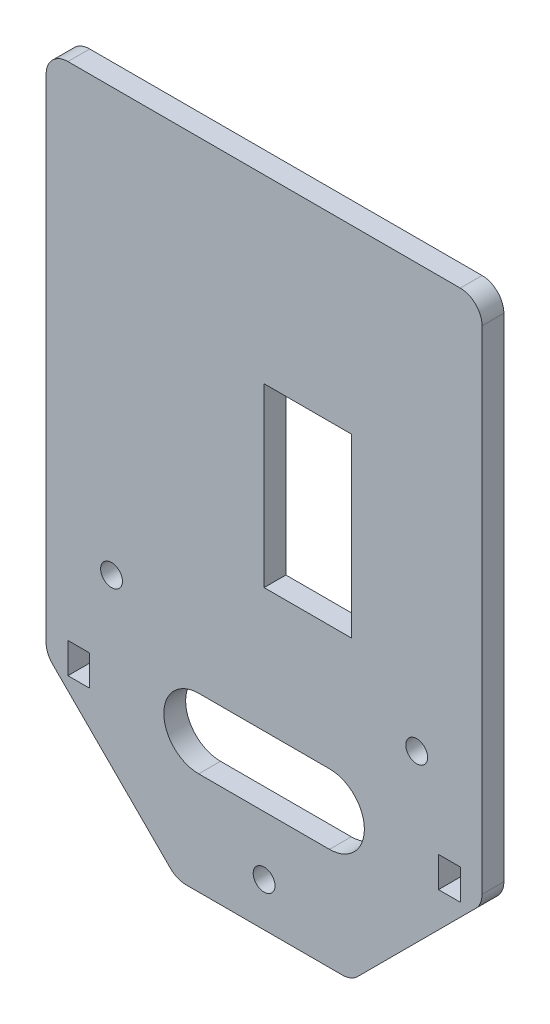
ISO-10303-21;
HEADER;
FILE_DESCRIPTION(('STEP AP214'),'2;1');
FILE_NAME('part.step','',(''),(''),'','','');
FILE_SCHEMA(('AUTOMOTIVE_DESIGN { 1 0 10303 214 1 1 1 1 }'));
ENDSEC;
DATA;
#1=APPLICATION_CONTEXT('core data for automotive mechanical design processes');
#2=APPLICATION_PROTOCOL_DEFINITION('international standard','automotive_design',2000,#1);
#3=PRODUCT_CONTEXT('',#1,'mechanical');
#4=PRODUCT('Part','Part','',(#3));
#5=PRODUCT_RELATED_PRODUCT_CATEGORY('part','',(#4));
#6=PRODUCT_DEFINITION_FORMATION('','',#4);
#7=PRODUCT_DEFINITION_CONTEXT('part definition',#1,'design');
#8=PRODUCT_DEFINITION('design','',#6,#7);
#9=PRODUCT_DEFINITION_SHAPE('','',#8);
#10=(LENGTH_UNIT() NAMED_UNIT(*) SI_UNIT(.MILLI.,.METRE.));
#11=(NAMED_UNIT(*) PLANE_ANGLE_UNIT() SI_UNIT($,.RADIAN.));
#12=(NAMED_UNIT(*) SI_UNIT($,.STERADIAN.) SOLID_ANGLE_UNIT());
#13=UNCERTAINTY_MEASURE_WITH_UNIT(LENGTH_MEASURE(1.E-05),#10,'distance_accuracy_value','');
#14=(GEOMETRIC_REPRESENTATION_CONTEXT(3) GLOBAL_UNCERTAINTY_ASSIGNED_CONTEXT((#13)) GLOBAL_UNIT_ASSIGNED_CONTEXT((#10,
#11,#12)) REPRESENTATION_CONTEXT('',''));
#15=CARTESIAN_POINT('',(0.,0.,0.));
#16=DIRECTION('',(0.,0.,1.));
#17=DIRECTION('',(1.,0.,0.));
#18=AXIS2_PLACEMENT_3D('',#15,#16,#17);
#19=CARTESIAN_POINT('',(100.,40.,5.));
#20=DIRECTION('',(-1.,0.,0.));
#21=DIRECTION('',(0.,0.,1.));
#22=AXIS2_PLACEMENT_3D('',#19,#20,#21);
#23=PLANE('',#22);
#24=DIRECTION('',(0.,1.,0.));
#25=VECTOR('',#24,1.);
#26=CARTESIAN_POINT('',(100.,40.,0.));
#27=LINE('',#26,#25);
#28=CARTESIAN_POINT('',(100.,42.0710678118655,0.));
#29=VERTEX_POINT('',#28);
#30=CARTESIAN_POINT('',(100.,155.,0.));
#31=VERTEX_POINT('',#30);
#32=EDGE_CURVE('E290',#29,#31,#27,.T.);
#33=ORIENTED_EDGE('',*,*,#32,.T.);
#34=DIRECTION('',(0.,0.,-1.));
#35=VECTOR('',#34,1.);
#36=CARTESIAN_POINT('',(100.,155.,5.));
#37=LINE('',#36,#35);
#38=CARTESIAN_POINT('',(100.,155.,5.));
#39=VERTEX_POINT('',#38);
#40=EDGE_CURVE('E445',#31,#39,#37,.F.);
#41=ORIENTED_EDGE('',*,*,#40,.T.);
#42=DIRECTION('',(0.,1.,0.));
#43=VECTOR('',#42,1.);
#44=CARTESIAN_POINT('',(100.,40.,5.));
#45=LINE('',#44,#43);
#46=CARTESIAN_POINT('',(100.,42.0710678118655,5.));
#47=VERTEX_POINT('',#46);
#48=EDGE_CURVE('E369',#47,#39,#45,.T.);
#49=ORIENTED_EDGE('',*,*,#48,.F.);
#50=DIRECTION('',(0.,0.,-1.));
#51=VECTOR('',#50,1.);
#52=CARTESIAN_POINT('',(100.,42.0710678118655,5.));
#53=LINE('',#52,#51);
#54=EDGE_CURVE('E409',#47,#29,#53,.T.);
#55=ORIENTED_EDGE('',*,*,#54,.T.);
#56=EDGE_LOOP('',(#33,#41,#49,#55));
#57=FACE_BOUND('',#56,.T.);
#58=ADVANCED_FACE('F33',(#57),#23,.F.);
#59=CARTESIAN_POINT('',(0.,160.,5.));
#60=DIRECTION('',(0.,-1.,0.));
#61=DIRECTION('',(0.,0.,-1.));
#62=AXIS2_PLACEMENT_3D('',#59,#60,#61);
#63=PLANE('',#62);
#64=DIRECTION('',(-1.,0.,0.));
#65=VECTOR('',#64,1.);
#66=CARTESIAN_POINT('',(0.,160.,0.));
#67=LINE('',#66,#65);
#68=CARTESIAN_POINT('',(95.,160.,0.));
#69=VERTEX_POINT('',#68);
#70=CARTESIAN_POINT('',(5.,160.,0.));
#71=VERTEX_POINT('',#70);
#72=EDGE_CURVE('E388',#69,#71,#67,.T.);
#73=ORIENTED_EDGE('',*,*,#72,.T.);
#74=DIRECTION('',(0.,0.,-1.));
#75=VECTOR('',#74,1.);
#76=CARTESIAN_POINT('',(5.,160.,5.));
#77=LINE('',#76,#75);
#78=CARTESIAN_POINT('',(5.,160.,5.));
#79=VERTEX_POINT('',#78);
#80=EDGE_CURVE('E41',#71,#79,#77,.F.);
#81=ORIENTED_EDGE('',*,*,#80,.T.);
#82=DIRECTION('',(-1.,0.,0.));
#83=VECTOR('',#82,1.);
#84=CARTESIAN_POINT('',(0.,160.,5.));
#85=LINE('',#84,#83);
#86=CARTESIAN_POINT('',(95.,160.,5.));
#87=VERTEX_POINT('',#86);
#88=EDGE_CURVE('E372',#87,#79,#85,.T.);
#89=ORIENTED_EDGE('',*,*,#88,.F.);
#90=DIRECTION('',(0.,0.,-1.));
#91=VECTOR('',#90,1.);
#92=CARTESIAN_POINT('',(95.,160.,5.));
#93=LINE('',#92,#91);
#94=EDGE_CURVE('E440',#87,#69,#93,.T.);
#95=ORIENTED_EDGE('',*,*,#94,.T.);
#96=EDGE_LOOP('',(#73,#81,#89,#95));
#97=FACE_BOUND('',#96,.T.);
#98=ADVANCED_FACE('F456',(#97),#63,.F.);
#99=CARTESIAN_POINT('',(0.,40.,5.));
#100=DIRECTION('',(1.,0.,0.));
#101=DIRECTION('',(0.,0.,-1.));
#102=AXIS2_PLACEMENT_3D('',#99,#100,#101);
#103=PLANE('',#102);
#104=DIRECTION('',(0.,-1.,0.));
#105=VECTOR('',#104,1.);
#106=CARTESIAN_POINT('',(0.,40.,5.));
#107=LINE('',#106,#105);
#108=CARTESIAN_POINT('',(0.,155.,5.));
#109=VERTEX_POINT('',#108);
#110=CARTESIAN_POINT('',(0.,42.0710678118655,5.));
#111=VERTEX_POINT('',#110);
#112=EDGE_CURVE('E376',#109,#111,#107,.T.);
#113=ORIENTED_EDGE('',*,*,#112,.F.);
#114=DIRECTION('',(0.,0.,-1.));
#115=VECTOR('',#114,1.);
#116=CARTESIAN_POINT('',(0.,155.,5.));
#117=LINE('',#116,#115);
#118=CARTESIAN_POINT('',(0.,155.,0.));
#119=VERTEX_POINT('',#118);
#120=EDGE_CURVE('E449',#109,#119,#117,.T.);
#121=ORIENTED_EDGE('',*,*,#120,.T.);
#122=DIRECTION('',(0.,-1.,0.));
#123=VECTOR('',#122,1.);
#124=CARTESIAN_POINT('',(0.,40.,0.));
#125=LINE('',#124,#123);
#126=CARTESIAN_POINT('',(0.,42.0710678118655,0.));
#127=VERTEX_POINT('',#126);
#128=EDGE_CURVE('E391',#119,#127,#125,.T.);
#129=ORIENTED_EDGE('',*,*,#128,.T.);
#130=DIRECTION('',(0.,0.,-1.));
#131=VECTOR('',#130,1.);
#132=CARTESIAN_POINT('',(0.,42.0710678118655,5.));
#133=LINE('',#132,#131);
#134=EDGE_CURVE('E404',#127,#111,#133,.F.);
#135=ORIENTED_EDGE('',*,*,#134,.T.);
#136=EDGE_LOOP('',(#113,#121,#129,#135));
#137=FACE_BOUND('',#136,.T.);
#138=ADVANCED_FACE('F468',(#137),#103,.F.);
#139=CARTESIAN_POINT('',(0.,40.,5.));
#140=DIRECTION('',(0.707106781186548,0.707106781186548,0.));
#141=DIRECTION('',(-0.707106781186548,0.707106781186548,0.));
#142=AXIS2_PLACEMENT_3D('',#139,#140,#141);
#143=PLANE('',#142);
#144=DIRECTION('',(0.707106781186547,-0.707106781186547,0.));
#145=VECTOR('',#144,1.);
#146=CARTESIAN_POINT('',(0.,40.,0.));
#147=LINE('',#146,#145);
#148=CARTESIAN_POINT('',(1.46446609406726,38.5355339059327,0.));
#149=VERTEX_POINT('',#148);
#150=CARTESIAN_POINT('',(28.5355339059327,11.4644660940673,0.));
#151=VERTEX_POINT('',#150);
#152=EDGE_CURVE('E393',#149,#151,#147,.T.);
#153=ORIENTED_EDGE('',*,*,#152,.T.);
#154=DIRECTION('',(0.,0.,-1.));
#155=VECTOR('',#154,1.);
#156=CARTESIAN_POINT('',(28.5355339059327,11.4644660940673,5.));
#157=LINE('',#156,#155);
#158=CARTESIAN_POINT('',(28.5355339059327,11.4644660940673,5.));
#159=VERTEX_POINT('',#158);
#160=EDGE_CURVE('E436',#151,#159,#157,.F.);
#161=ORIENTED_EDGE('',*,*,#160,.T.);
#162=DIRECTION('',(0.707106781186547,-0.707106781186547,0.));
#163=VECTOR('',#162,1.);
#164=CARTESIAN_POINT('',(0.,40.,5.));
#165=LINE('',#164,#163);
#166=CARTESIAN_POINT('',(1.46446609406726,38.5355339059327,5.));
#167=VERTEX_POINT('',#166);
#168=EDGE_CURVE('E378',#167,#159,#165,.T.);
#169=ORIENTED_EDGE('',*,*,#168,.F.);
#170=DIRECTION('',(0.,0.,-1.));
#171=VECTOR('',#170,1.);
#172=CARTESIAN_POINT('',(1.46446609406726,38.5355339059327,5.));
#173=LINE('',#172,#171);
#174=EDGE_CURVE('E385',#167,#149,#173,.T.);
#175=ORIENTED_EDGE('',*,*,#174,.T.);
#176=EDGE_LOOP('',(#153,#161,#169,#175));
#177=FACE_BOUND('',#176,.T.);
#178=ADVANCED_FACE('F479',(#177),#143,.F.);
#179=CARTESIAN_POINT('',(30.,10.,5.));
#180=DIRECTION('',(0.,1.,0.));
#181=DIRECTION('',(0.,0.,1.));
#182=AXIS2_PLACEMENT_3D('',#179,#180,#181);
#183=PLANE('',#182);
#184=DIRECTION('',(1.,0.,0.));
#185=VECTOR('',#184,1.);
#186=CARTESIAN_POINT('',(30.,10.,5.));
#187=LINE('',#186,#185);
#188=CARTESIAN_POINT('',(32.0710678118655,10.,5.));
#189=VERTEX_POINT('',#188);
#190=CARTESIAN_POINT('',(67.9289321881345,10.,5.));
#191=VERTEX_POINT('',#190);
#192=EDGE_CURVE('E381',#189,#191,#187,.T.);
#193=ORIENTED_EDGE('',*,*,#192,.F.);
#194=DIRECTION('',(0.,0.,-1.));
#195=VECTOR('',#194,1.);
#196=CARTESIAN_POINT('',(32.0710678118655,10.,5.));
#197=LINE('',#196,#195);
#198=CARTESIAN_POINT('',(32.0710678118655,10.,0.));
#199=VERTEX_POINT('',#198);
#200=EDGE_CURVE('E431',#189,#199,#197,.T.);
#201=ORIENTED_EDGE('',*,*,#200,.T.);
#202=DIRECTION('',(1.,0.,0.));
#203=VECTOR('',#202,1.);
#204=CARTESIAN_POINT('',(30.,10.,0.));
#205=LINE('',#204,#203);
#206=CARTESIAN_POINT('',(67.9289321881345,10.,0.));
#207=VERTEX_POINT('',#206);
#208=EDGE_CURVE('E396',#199,#207,#205,.T.);
#209=ORIENTED_EDGE('',*,*,#208,.T.);
#210=DIRECTION('',(0.,0.,-1.));
#211=VECTOR('',#210,1.);
#212=CARTESIAN_POINT('',(67.9289321881345,10.,5.));
#213=LINE('',#212,#211);
#214=EDGE_CURVE('E426',#207,#191,#213,.F.);
#215=ORIENTED_EDGE('',*,*,#214,.T.);
#216=EDGE_LOOP('',(#193,#201,#209,#215));
#217=FACE_BOUND('',#216,.T.);
#218=ADVANCED_FACE('F486',(#217),#183,.F.);
#219=CARTESIAN_POINT('',(100.,40.,5.));
#220=DIRECTION('',(-0.707106781186548,0.707106781186548,0.));
#221=DIRECTION('',(-0.707106781186548,-0.707106781186548,0.));
#222=AXIS2_PLACEMENT_3D('',#219,#220,#221);
#223=PLANE('',#222);
#224=DIRECTION('',(0.707106781186547,0.707106781186547,0.));
#225=VECTOR('',#224,1.);
#226=CARTESIAN_POINT('',(100.,40.,5.));
#227=LINE('',#226,#225);
#228=CARTESIAN_POINT('',(71.4644660940673,11.4644660940673,5.));
#229=VERTEX_POINT('',#228);
#230=CARTESIAN_POINT('',(98.5355339059327,38.5355339059327,5.));
#231=VERTEX_POINT('',#230);
#232=EDGE_CURVE('E383',#229,#231,#227,.T.);
#233=ORIENTED_EDGE('',*,*,#232,.F.);
#234=DIRECTION('',(0.,0.,-1.));
#235=VECTOR('',#234,1.);
#236=CARTESIAN_POINT('',(71.4644660940673,11.4644660940673,5.));
#237=LINE('',#236,#235);
#238=CARTESIAN_POINT('',(71.4644660940673,11.4644660940673,0.));
#239=VERTEX_POINT('',#238);
#240=EDGE_CURVE('E420',#229,#239,#237,.T.);
#241=ORIENTED_EDGE('',*,*,#240,.T.);
#242=DIRECTION('',(0.707106781186547,0.707106781186547,0.));
#243=VECTOR('',#242,1.);
#244=CARTESIAN_POINT('',(100.,40.,0.));
#245=LINE('',#244,#243);
#246=CARTESIAN_POINT('',(98.5355339059327,38.5355339059327,0.));
#247=VERTEX_POINT('',#246);
#248=EDGE_CURVE('E373',#239,#247,#245,.T.);
#249=ORIENTED_EDGE('',*,*,#248,.T.);
#250=DIRECTION('',(0.,0.,-1.));
#251=VECTOR('',#250,1.);
#252=CARTESIAN_POINT('',(98.5355339059327,38.5355339059327,5.));
#253=LINE('',#252,#251);
#254=EDGE_CURVE('E415',#247,#231,#253,.F.);
#255=ORIENTED_EDGE('',*,*,#254,.T.);
#256=EDGE_LOOP('',(#233,#241,#249,#255));
#257=FACE_BOUND('',#256,.T.);
#258=ADVANCED_FACE('F495',(#257),#223,.F.);
#259=CARTESIAN_POINT('',(0.,0.,5.));
#260=DIRECTION('',(0.,0.,-1.));
#261=DIRECTION('',(-1.,0.,0.));
#262=AXIS2_PLACEMENT_3D('',#259,#260,#261);
#263=PLANE('',#262);
#264=DIRECTION('',(1.,0.,0.));
#265=VECTOR('',#264,1.);
#266=CARTESIAN_POINT('',(5.,38.,5.));
#267=LINE('',#266,#265);
#268=CARTESIAN_POINT('',(5.,38.,5.));
#269=VERTEX_POINT('',#268);
#270=CARTESIAN_POINT('',(9.99999999999999,38.,5.));
#271=VERTEX_POINT('',#270);
#272=EDGE_CURVE('E247',#269,#271,#267,.T.);
#273=ORIENTED_EDGE('',*,*,#272,.F.);
#274=DIRECTION('',(0.,-1.,0.));
#275=VECTOR('',#274,1.);
#276=CARTESIAN_POINT('',(5.,45.,5.));
#277=LINE('',#276,#275);
#278=CARTESIAN_POINT('',(5.,45.,5.));
#279=VERTEX_POINT('',#278);
#280=EDGE_CURVE('E48',#279,#269,#277,.T.);
#281=ORIENTED_EDGE('',*,*,#280,.F.);
#282=DIRECTION('',(-1.,0.,0.));
#283=VECTOR('',#282,1.);
#284=CARTESIAN_POINT('',(5.,45.,5.));
#285=LINE('',#284,#283);
#286=CARTESIAN_POINT('',(10.,45.,5.));
#287=VERTEX_POINT('',#286);
#288=EDGE_CURVE('E238',#287,#279,#285,.T.);
#289=ORIENTED_EDGE('',*,*,#288,.F.);
#290=DIRECTION('',(0.,1.,0.));
#291=VECTOR('',#290,1.);
#292=CARTESIAN_POINT('',(10.,45.,5.));
#293=LINE('',#292,#291);
#294=EDGE_CURVE('E241',#271,#287,#293,.T.);
#295=ORIENTED_EDGE('',*,*,#294,.F.);
#296=EDGE_LOOP('',(#273,#281,#289,#295));
#297=FACE_BOUND('',#296,.T.);
#298=DIRECTION('',(1.,0.,0.));
#299=VECTOR('',#298,1.);
#300=CARTESIAN_POINT('',(90.,38.,5.));
#301=LINE('',#300,#299);
#302=CARTESIAN_POINT('',(90.,38.,5.));
#303=VERTEX_POINT('',#302);
#304=CARTESIAN_POINT('',(95.,38.,5.));
#305=VERTEX_POINT('',#304);
#306=EDGE_CURVE('E273',#303,#305,#301,.T.);
#307=ORIENTED_EDGE('',*,*,#306,.F.);
#308=DIRECTION('',(0.,-1.,0.));
#309=VECTOR('',#308,1.);
#310=CARTESIAN_POINT('',(90.,45.,5.));
#311=LINE('',#310,#309);
#312=CARTESIAN_POINT('',(90.,45.,5.));
#313=VERTEX_POINT('',#312);
#314=EDGE_CURVE('E56',#313,#303,#311,.T.);
#315=ORIENTED_EDGE('',*,*,#314,.F.);
#316=DIRECTION('',(-1.,0.,0.));
#317=VECTOR('',#316,1.);
#318=CARTESIAN_POINT('',(90.,45.,5.));
#319=LINE('',#318,#317);
#320=CARTESIAN_POINT('',(95.,45.,5.));
#321=VERTEX_POINT('',#320);
#322=EDGE_CURVE('E262',#321,#313,#319,.T.);
#323=ORIENTED_EDGE('',*,*,#322,.F.);
#324=DIRECTION('',(0.,1.,0.));
#325=VECTOR('',#324,1.);
#326=CARTESIAN_POINT('',(95.,45.,5.));
#327=LINE('',#326,#325);
#328=EDGE_CURVE('E276',#305,#321,#327,.T.);
#329=ORIENTED_EDGE('',*,*,#328,.F.);
#330=EDGE_LOOP('',(#307,#315,#323,#329));
#331=FACE_BOUND('',#330,.T.);
#332=CARTESIAN_POINT('',(50.,20.,5.));
#333=DIRECTION('',(0.,0.,1.));
#334=DIRECTION('',(1.,0.,0.));
#335=AXIS2_PLACEMENT_3D('',#332,#333,#334);
#336=CIRCLE('',#335,2.5);
#337=CARTESIAN_POINT('',(52.5,20.,5.));
#338=VERTEX_POINT('',#337);
#339=EDGE_CURVE('E291',#338,#338,#336,.T.);
#340=ORIENTED_EDGE('',*,*,#339,.F.);
#341=EDGE_LOOP('',(#340));
#342=FACE_BOUND('',#341,.T.);
#343=DIRECTION('',(1.,0.,0.));
#344=VECTOR('',#343,1.);
#345=CARTESIAN_POINT('',(35.,33.5,5.));
#346=LINE('',#345,#344);
#347=CARTESIAN_POINT('',(35.,33.5,5.));
#348=VERTEX_POINT('',#347);
#349=CARTESIAN_POINT('',(65.,33.5,5.));
#350=VERTEX_POINT('',#349);
#351=EDGE_CURVE('E344',#348,#350,#346,.T.);
#352=ORIENTED_EDGE('',*,*,#351,.F.);
#353=CARTESIAN_POINT('',(35.,41.5,5.));
#354=DIRECTION('',(0.,0.,1.));
#355=DIRECTION('',(1.,0.,0.));
#356=AXIS2_PLACEMENT_3D('',#353,#354,#355);
#357=CIRCLE('',#356,7.99999999999999);
#358=CARTESIAN_POINT('',(35.,49.5,5.));
#359=VERTEX_POINT('',#358);
#360=EDGE_CURVE('E254',#359,#348,#357,.T.);
#361=ORIENTED_EDGE('',*,*,#360,.F.);
#362=DIRECTION('',(-1.,0.,0.));
#363=VECTOR('',#362,1.);
#364=CARTESIAN_POINT('',(35.,49.5,5.));
#365=LINE('',#364,#363);
#366=CARTESIAN_POINT('',(65.,49.5,5.));
#367=VERTEX_POINT('',#366);
#368=EDGE_CURVE('E333',#367,#359,#365,.T.);
#369=ORIENTED_EDGE('',*,*,#368,.F.);
#370=CARTESIAN_POINT('',(65.,41.5,5.));
#371=DIRECTION('',(0.,0.,1.));
#372=DIRECTION('',(1.,0.,0.));
#373=AXIS2_PLACEMENT_3D('',#370,#371,#372);
#374=CIRCLE('',#373,8.);
#375=EDGE_CURVE('E347',#350,#367,#374,.T.);
#376=ORIENTED_EDGE('',*,*,#375,.F.);
#377=EDGE_LOOP('',(#352,#361,#369,#376));
#378=FACE_BOUND('',#377,.T.);
#379=DIRECTION('',(1.,0.,0.));
#380=VECTOR('',#379,1.);
#381=CARTESIAN_POINT('',(50.,78.,5.));
#382=LINE('',#381,#380);
#383=CARTESIAN_POINT('',(50.,78.,5.));
#384=VERTEX_POINT('',#383);
#385=CARTESIAN_POINT('',(70.,78.,5.));
#386=VERTEX_POINT('',#385);
#387=EDGE_CURVE('E311',#384,#386,#382,.T.);
#388=ORIENTED_EDGE('',*,*,#387,.F.);
#389=DIRECTION('',(0.,-1.,0.));
#390=VECTOR('',#389,1.);
#391=CARTESIAN_POINT('',(50.,78.,5.));
#392=LINE('',#391,#390);
#393=CARTESIAN_POINT('',(50.,118.5,5.));
#394=VERTEX_POINT('',#393);
#395=EDGE_CURVE('E309',#394,#384,#392,.T.);
#396=ORIENTED_EDGE('',*,*,#395,.F.);
#397=DIRECTION('',(-1.,0.,0.));
#398=VECTOR('',#397,1.);
#399=CARTESIAN_POINT('',(50.,118.5,5.));
#400=LINE('',#399,#398);
#401=CARTESIAN_POINT('',(70.,118.5,5.));
#402=VERTEX_POINT('',#401);
#403=EDGE_CURVE('E299',#402,#394,#400,.T.);
#404=ORIENTED_EDGE('',*,*,#403,.F.);
#405=DIRECTION('',(0.,1.,0.));
#406=VECTOR('',#405,1.);
#407=CARTESIAN_POINT('',(70.,78.,5.));
#408=LINE('',#407,#406);
#409=EDGE_CURVE('E315',#386,#402,#408,.T.);
#410=ORIENTED_EDGE('',*,*,#409,.F.);
#411=EDGE_LOOP('',(#388,#396,#404,#410));
#412=FACE_BOUND('',#411,.T.);
#413=CARTESIAN_POINT('',(15.,63.,5.));
#414=DIRECTION('',(0.,0.,1.));
#415=DIRECTION('',(1.,0.,0.));
#416=AXIS2_PLACEMENT_3D('',#413,#414,#415);
#417=CIRCLE('',#416,2.5);
#418=CARTESIAN_POINT('',(17.5,63.,5.));
#419=VERTEX_POINT('',#418);
#420=EDGE_CURVE('E322',#419,#419,#417,.T.);
#421=ORIENTED_EDGE('',*,*,#420,.F.);
#422=EDGE_LOOP('',(#421));
#423=FACE_BOUND('',#422,.T.);
#424=CARTESIAN_POINT('',(85.,63.,5.));
#425=DIRECTION('',(0.,0.,1.));
#426=DIRECTION('',(1.,0.,0.));
#427=AXIS2_PLACEMENT_3D('',#424,#425,#426);
#428=CIRCLE('',#427,2.50000000000001);
#429=CARTESIAN_POINT('',(87.5,63.,5.));
#430=VERTEX_POINT('',#429);
#431=EDGE_CURVE('E361',#430,#430,#428,.T.);
#432=ORIENTED_EDGE('',*,*,#431,.F.);
#433=EDGE_LOOP('',(#432));
#434=FACE_BOUND('',#433,.T.);
#435=ORIENTED_EDGE('',*,*,#88,.T.);
#436=CARTESIAN_POINT('',(5.,155.,5.));
#437=DIRECTION('',(0.,0.,-1.));
#438=DIRECTION('',(-1.,0.,0.));
#439=AXIS2_PLACEMENT_3D('',#436,#437,#438);
#440=CIRCLE('',#439,5.);
#441=EDGE_CURVE('E11',#79,#109,#440,.F.);
#442=ORIENTED_EDGE('',*,*,#441,.T.);
#443=ORIENTED_EDGE('',*,*,#112,.T.);
#444=CARTESIAN_POINT('',(5.,42.0710678118655,5.));
#445=DIRECTION('',(0.,0.,-1.));
#446=DIRECTION('',(-1.,0.,0.));
#447=AXIS2_PLACEMENT_3D('',#444,#445,#446);
#448=CIRCLE('',#447,5.);
#449=EDGE_CURVE('E407',#111,#167,#448,.F.);
#450=ORIENTED_EDGE('',*,*,#449,.T.);
#451=ORIENTED_EDGE('',*,*,#168,.T.);
#452=CARTESIAN_POINT('',(32.0710678118655,15.,5.));
#453=DIRECTION('',(0.,0.,-1.));
#454=DIRECTION('',(-1.,0.,0.));
#455=AXIS2_PLACEMENT_3D('',#452,#453,#454);
#456=CIRCLE('',#455,5.);
#457=EDGE_CURVE('E438',#159,#189,#456,.F.);
#458=ORIENTED_EDGE('',*,*,#457,.T.);
#459=ORIENTED_EDGE('',*,*,#192,.T.);
#460=CARTESIAN_POINT('',(67.9289321881345,15.,5.));
#461=DIRECTION('',(0.,0.,-1.));
#462=DIRECTION('',(-1.,0.,0.));
#463=AXIS2_PLACEMENT_3D('',#460,#461,#462);
#464=CIRCLE('',#463,5.);
#465=EDGE_CURVE('E429',#191,#229,#464,.F.);
#466=ORIENTED_EDGE('',*,*,#465,.T.);
#467=ORIENTED_EDGE('',*,*,#232,.T.);
#468=CARTESIAN_POINT('',(95.,42.0710678118655,5.));
#469=DIRECTION('',(0.,0.,-1.));
#470=DIRECTION('',(-1.,0.,0.));
#471=AXIS2_PLACEMENT_3D('',#468,#469,#470);
#472=CIRCLE('',#471,5.);
#473=EDGE_CURVE('E418',#231,#47,#472,.F.);
#474=ORIENTED_EDGE('',*,*,#473,.T.);
#475=ORIENTED_EDGE('',*,*,#48,.T.);
#476=CARTESIAN_POINT('',(95.,155.,5.));
#477=DIRECTION('',(0.,0.,-1.));
#478=DIRECTION('',(-1.,0.,0.));
#479=AXIS2_PLACEMENT_3D('',#476,#477,#478);
#480=CIRCLE('',#479,5.);
#481=EDGE_CURVE('E447',#39,#87,#480,.F.);
#482=ORIENTED_EDGE('',*,*,#481,.T.);
#483=EDGE_LOOP('',(#435,#442,#443,#450,#451,#458,#459,#466,#467,#474,#475,#482));
#484=FACE_BOUND('',#483,.T.);
#485=ADVANCED_FACE('F462',(#297,#331,#342,#378,#412,#423,#434,#484),#263,.F.);
#486=CARTESIAN_POINT('',(0.,0.,0.));
#487=DIRECTION('',(0.,0.,-1.));
#488=DIRECTION('',(-1.,0.,0.));
#489=AXIS2_PLACEMENT_3D('',#486,#487,#488);
#490=PLANE('',#489);
#491=DIRECTION('',(0.,-1.,0.));
#492=VECTOR('',#491,1.);
#493=CARTESIAN_POINT('',(5.,45.,0.));
#494=LINE('',#493,#492);
#495=CARTESIAN_POINT('',(5.,45.,0.));
#496=VERTEX_POINT('',#495);
#497=CARTESIAN_POINT('',(5.,38.,0.));
#498=VERTEX_POINT('',#497);
#499=EDGE_CURVE('E219',#496,#498,#494,.T.);
#500=ORIENTED_EDGE('',*,*,#499,.T.);
#501=DIRECTION('',(1.,0.,0.));
#502=VECTOR('',#501,1.);
#503=CARTESIAN_POINT('',(5.,38.,0.));
#504=LINE('',#503,#502);
#505=CARTESIAN_POINT('',(9.99999999999999,38.,0.));
#506=VERTEX_POINT('',#505);
#507=EDGE_CURVE('E229',#498,#506,#504,.T.);
#508=ORIENTED_EDGE('',*,*,#507,.T.);
#509=DIRECTION('',(0.,1.,0.));
#510=VECTOR('',#509,1.);
#511=CARTESIAN_POINT('',(10.,45.,0.));
#512=LINE('',#511,#510);
#513=CARTESIAN_POINT('',(10.,45.,0.));
#514=VERTEX_POINT('',#513);
#515=EDGE_CURVE('E233',#506,#514,#512,.T.);
#516=ORIENTED_EDGE('',*,*,#515,.T.);
#517=DIRECTION('',(-1.,0.,0.));
#518=VECTOR('',#517,1.);
#519=CARTESIAN_POINT('',(5.,45.,0.));
#520=LINE('',#519,#518);
#521=EDGE_CURVE('E225',#514,#496,#520,.T.);
#522=ORIENTED_EDGE('',*,*,#521,.T.);
#523=EDGE_LOOP('',(#500,#508,#516,#522));
#524=FACE_BOUND('',#523,.T.);
#525=DIRECTION('',(0.,-1.,0.));
#526=VECTOR('',#525,1.);
#527=CARTESIAN_POINT('',(90.,45.,0.));
#528=LINE('',#527,#526);
#529=CARTESIAN_POINT('',(90.,45.,0.));
#530=VERTEX_POINT('',#529);
#531=CARTESIAN_POINT('',(90.,38.,0.));
#532=VERTEX_POINT('',#531);
#533=EDGE_CURVE('E258',#530,#532,#528,.T.);
#534=ORIENTED_EDGE('',*,*,#533,.T.);
#535=DIRECTION('',(1.,0.,0.));
#536=VECTOR('',#535,1.);
#537=CARTESIAN_POINT('',(90.,38.,0.));
#538=LINE('',#537,#536);
#539=CARTESIAN_POINT('',(95.,38.,0.));
#540=VERTEX_POINT('',#539);
#541=EDGE_CURVE('E261',#532,#540,#538,.T.);
#542=ORIENTED_EDGE('',*,*,#541,.T.);
#543=DIRECTION('',(0.,1.,0.));
#544=VECTOR('',#543,1.);
#545=CARTESIAN_POINT('',(95.,45.,0.));
#546=LINE('',#545,#544);
#547=CARTESIAN_POINT('',(95.,45.,0.));
#548=VERTEX_POINT('',#547);
#549=EDGE_CURVE('E265',#540,#548,#546,.T.);
#550=ORIENTED_EDGE('',*,*,#549,.T.);
#551=DIRECTION('',(-1.,0.,0.));
#552=VECTOR('',#551,1.);
#553=CARTESIAN_POINT('',(90.,45.,0.));
#554=LINE('',#553,#552);
#555=EDGE_CURVE('E268',#548,#530,#554,.T.);
#556=ORIENTED_EDGE('',*,*,#555,.T.);
#557=EDGE_LOOP('',(#534,#542,#550,#556));
#558=FACE_BOUND('',#557,.T.);
#559=CARTESIAN_POINT('',(50.,20.,0.));
#560=DIRECTION('',(0.,0.,1.));
#561=DIRECTION('',(1.,0.,0.));
#562=AXIS2_PLACEMENT_3D('',#559,#560,#561);
#563=CIRCLE('',#562,2.5);
#564=CARTESIAN_POINT('',(52.5,20.,0.));
#565=VERTEX_POINT('',#564);
#566=EDGE_CURVE('E287',#565,#565,#563,.T.);
#567=ORIENTED_EDGE('',*,*,#566,.T.);
#568=EDGE_LOOP('',(#567));
#569=FACE_BOUND('',#568,.T.);
#570=CARTESIAN_POINT('',(35.,41.5,0.));
#571=DIRECTION('',(0.,0.,1.));
#572=DIRECTION('',(1.,0.,0.));
#573=AXIS2_PLACEMENT_3D('',#570,#571,#572);
#574=CIRCLE('',#573,7.99999999999999);
#575=CARTESIAN_POINT('',(35.,49.5,0.));
#576=VERTEX_POINT('',#575);
#577=CARTESIAN_POINT('',(35.,33.5,0.));
#578=VERTEX_POINT('',#577);
#579=EDGE_CURVE('E329',#576,#578,#574,.T.);
#580=ORIENTED_EDGE('',*,*,#579,.T.);
#581=DIRECTION('',(1.,0.,0.));
#582=VECTOR('',#581,1.);
#583=CARTESIAN_POINT('',(35.,33.5,0.));
#584=LINE('',#583,#582);
#585=CARTESIAN_POINT('',(65.,33.5,0.));
#586=VERTEX_POINT('',#585);
#587=EDGE_CURVE('E332',#578,#586,#584,.T.);
#588=ORIENTED_EDGE('',*,*,#587,.T.);
#589=CARTESIAN_POINT('',(65.,41.5,0.));
#590=DIRECTION('',(0.,0.,1.));
#591=DIRECTION('',(1.,0.,0.));
#592=AXIS2_PLACEMENT_3D('',#589,#590,#591);
#593=CIRCLE('',#592,8.);
#594=CARTESIAN_POINT('',(65.,49.5,0.));
#595=VERTEX_POINT('',#594);
#596=EDGE_CURVE('E336',#586,#595,#593,.T.);
#597=ORIENTED_EDGE('',*,*,#596,.T.);
#598=DIRECTION('',(-1.,0.,0.));
#599=VECTOR('',#598,1.);
#600=CARTESIAN_POINT('',(35.,49.5,0.));
#601=LINE('',#600,#599);
#602=EDGE_CURVE('E339',#595,#576,#601,.T.);
#603=ORIENTED_EDGE('',*,*,#602,.T.);
#604=EDGE_LOOP('',(#580,#588,#597,#603));
#605=FACE_BOUND('',#604,.T.);
#606=DIRECTION('',(0.,-1.,0.));
#607=VECTOR('',#606,1.);
#608=CARTESIAN_POINT('',(50.,78.,0.));
#609=LINE('',#608,#607);
#610=CARTESIAN_POINT('',(50.,118.5,0.));
#611=VERTEX_POINT('',#610);
#612=CARTESIAN_POINT('',(50.,78.,0.));
#613=VERTEX_POINT('',#612);
#614=EDGE_CURVE('E295',#611,#613,#609,.T.);
#615=ORIENTED_EDGE('',*,*,#614,.T.);
#616=DIRECTION('',(1.,0.,0.));
#617=VECTOR('',#616,1.);
#618=CARTESIAN_POINT('',(50.,78.,0.));
#619=LINE('',#618,#617);
#620=CARTESIAN_POINT('',(70.,78.,0.));
#621=VERTEX_POINT('',#620);
#622=EDGE_CURVE('E298',#613,#621,#619,.T.);
#623=ORIENTED_EDGE('',*,*,#622,.T.);
#624=DIRECTION('',(0.,1.,0.));
#625=VECTOR('',#624,1.);
#626=CARTESIAN_POINT('',(70.,78.,0.));
#627=LINE('',#626,#625);
#628=CARTESIAN_POINT('',(70.,118.5,0.));
#629=VERTEX_POINT('',#628);
#630=EDGE_CURVE('E302',#621,#629,#627,.T.);
#631=ORIENTED_EDGE('',*,*,#630,.T.);
#632=DIRECTION('',(-1.,0.,0.));
#633=VECTOR('',#632,1.);
#634=CARTESIAN_POINT('',(50.,118.5,0.));
#635=LINE('',#634,#633);
#636=EDGE_CURVE('E305',#629,#611,#635,.T.);
#637=ORIENTED_EDGE('',*,*,#636,.T.);
#638=EDGE_LOOP('',(#615,#623,#631,#637));
#639=FACE_BOUND('',#638,.T.);
#640=CARTESIAN_POINT('',(15.,63.,0.));
#641=DIRECTION('',(0.,0.,1.));
#642=DIRECTION('',(1.,0.,0.));
#643=AXIS2_PLACEMENT_3D('',#640,#641,#642);
#644=CIRCLE('',#643,2.5);
#645=CARTESIAN_POINT('',(17.5,63.,0.));
#646=VERTEX_POINT('',#645);
#647=EDGE_CURVE('E364',#646,#646,#644,.T.);
#648=ORIENTED_EDGE('',*,*,#647,.T.);
#649=EDGE_LOOP('',(#648));
#650=FACE_BOUND('',#649,.T.);
#651=CARTESIAN_POINT('',(85.,63.,0.));
#652=DIRECTION('',(0.,0.,1.));
#653=DIRECTION('',(1.,0.,0.));
#654=AXIS2_PLACEMENT_3D('',#651,#652,#653);
#655=CIRCLE('',#654,2.50000000000001);
#656=CARTESIAN_POINT('',(87.5,63.,0.));
#657=VERTEX_POINT('',#656);
#658=EDGE_CURVE('E294',#657,#657,#655,.T.);
#659=ORIENTED_EDGE('',*,*,#658,.T.);
#660=EDGE_LOOP('',(#659));
#661=FACE_BOUND('',#660,.T.);
#662=ORIENTED_EDGE('',*,*,#128,.F.);
#663=CARTESIAN_POINT('',(5.,155.,0.));
#664=DIRECTION('',(0.,0.,-1.));
#665=DIRECTION('',(-1.,0.,0.));
#666=AXIS2_PLACEMENT_3D('',#663,#664,#665);
#667=CIRCLE('',#666,5.);
#668=EDGE_CURVE('E452',#119,#71,#667,.T.);
#669=ORIENTED_EDGE('',*,*,#668,.T.);
#670=ORIENTED_EDGE('',*,*,#72,.F.);
#671=CARTESIAN_POINT('',(95.,155.,0.));
#672=DIRECTION('',(0.,0.,-1.));
#673=DIRECTION('',(-1.,0.,0.));
#674=AXIS2_PLACEMENT_3D('',#671,#672,#673);
#675=CIRCLE('',#674,5.);
#676=EDGE_CURVE('E443',#69,#31,#675,.T.);
#677=ORIENTED_EDGE('',*,*,#676,.T.);
#678=ORIENTED_EDGE('',*,*,#32,.F.);
#679=CARTESIAN_POINT('',(95.,42.0710678118655,0.));
#680=DIRECTION('',(0.,0.,-1.));
#681=DIRECTION('',(-1.,0.,0.));
#682=AXIS2_PLACEMENT_3D('',#679,#680,#681);
#683=CIRCLE('',#682,5.);
#684=EDGE_CURVE('E412',#29,#247,#683,.T.);
#685=ORIENTED_EDGE('',*,*,#684,.T.);
#686=ORIENTED_EDGE('',*,*,#248,.F.);
#687=CARTESIAN_POINT('',(67.9289321881345,15.,0.));
#688=DIRECTION('',(0.,0.,-1.));
#689=DIRECTION('',(-1.,0.,0.));
#690=AXIS2_PLACEMENT_3D('',#687,#688,#689);
#691=CIRCLE('',#690,5.);
#692=EDGE_CURVE('E423',#239,#207,#691,.T.);
#693=ORIENTED_EDGE('',*,*,#692,.T.);
#694=ORIENTED_EDGE('',*,*,#208,.F.);
#695=CARTESIAN_POINT('',(32.0710678118655,15.,0.));
#696=DIRECTION('',(0.,0.,-1.));
#697=DIRECTION('',(-1.,0.,0.));
#698=AXIS2_PLACEMENT_3D('',#695,#696,#697);
#699=CIRCLE('',#698,5.);
#700=EDGE_CURVE('E434',#199,#151,#699,.T.);
#701=ORIENTED_EDGE('',*,*,#700,.T.);
#702=ORIENTED_EDGE('',*,*,#152,.F.);
#703=CARTESIAN_POINT('',(5.,42.0710678118655,0.));
#704=DIRECTION('',(0.,0.,-1.));
#705=DIRECTION('',(-1.,0.,0.));
#706=AXIS2_PLACEMENT_3D('',#703,#704,#705);
#707=CIRCLE('',#706,5.);
#708=EDGE_CURVE('E401',#149,#127,#707,.T.);
#709=ORIENTED_EDGE('',*,*,#708,.T.);
#710=EDGE_LOOP('',(#662,#669,#670,#677,#678,#685,#686,#693,#694,#701,#702,#709));
#711=FACE_BOUND('',#710,.T.);
#712=ADVANCED_FACE('F235',(#524,#558,#569,#605,#639,#650,#661,#711),#490,.T.);
#713=CARTESIAN_POINT('',(85.,63.,0.));
#714=DIRECTION('',(0.,0.,1.));
#715=DIRECTION('',(1.,0.,0.));
#716=AXIS2_PLACEMENT_3D('',#713,#714,#715);
#717=CYLINDRICAL_SURFACE('',#716,2.50000000000001);
#718=ORIENTED_EDGE('',*,*,#658,.F.);
#719=EDGE_LOOP('',(#718));
#720=FACE_BOUND('',#719,.T.);
#721=ORIENTED_EDGE('',*,*,#431,.T.);
#722=EDGE_LOOP('',(#721));
#723=FACE_BOUND('',#722,.T.);
#724=ADVANCED_FACE('F594',(#720,#723),#717,.F.);
#725=CARTESIAN_POINT('',(15.,63.,0.));
#726=DIRECTION('',(0.,0.,1.));
#727=DIRECTION('',(1.,0.,0.));
#728=AXIS2_PLACEMENT_3D('',#725,#726,#727);
#729=CYLINDRICAL_SURFACE('',#728,2.5);
#730=ORIENTED_EDGE('',*,*,#647,.F.);
#731=EDGE_LOOP('',(#730));
#732=FACE_BOUND('',#731,.T.);
#733=ORIENTED_EDGE('',*,*,#420,.T.);
#734=EDGE_LOOP('',(#733));
#735=FACE_BOUND('',#734,.T.);
#736=ADVANCED_FACE('F693',(#732,#735),#729,.F.);
#737=CARTESIAN_POINT('',(50.,78.,0.));
#738=DIRECTION('',(-1.,0.,0.));
#739=DIRECTION('',(0.,0.,1.));
#740=AXIS2_PLACEMENT_3D('',#737,#738,#739);
#741=PLANE('',#740);
#742=ORIENTED_EDGE('',*,*,#395,.T.);
#743=DIRECTION('',(0.,0.,1.));
#744=VECTOR('',#743,1.);
#745=CARTESIAN_POINT('',(50.,78.,0.));
#746=LINE('',#745,#744);
#747=EDGE_CURVE('E308',#613,#384,#746,.T.);
#748=ORIENTED_EDGE('',*,*,#747,.F.);
#749=ORIENTED_EDGE('',*,*,#614,.F.);
#750=DIRECTION('',(0.,0.,1.));
#751=VECTOR('',#750,1.);
#752=CARTESIAN_POINT('',(50.,118.5,0.));
#753=LINE('',#752,#751);
#754=EDGE_CURVE('E320',#611,#394,#753,.T.);
#755=ORIENTED_EDGE('',*,*,#754,.T.);
#756=EDGE_LOOP('',(#742,#748,#749,#755));
#757=FACE_BOUND('',#756,.T.);
#758=ADVANCED_FACE('F681',(#757),#741,.F.);
#759=CARTESIAN_POINT('',(50.,118.5,0.));
#760=DIRECTION('',(0.,1.,0.));
#761=DIRECTION('',(0.,0.,1.));
#762=AXIS2_PLACEMENT_3D('',#759,#760,#761);
#763=PLANE('',#762);
#764=ORIENTED_EDGE('',*,*,#403,.T.);
#765=ORIENTED_EDGE('',*,*,#754,.F.);
#766=ORIENTED_EDGE('',*,*,#636,.F.);
#767=DIRECTION('',(0.,0.,1.));
#768=VECTOR('',#767,1.);
#769=CARTESIAN_POINT('',(70.,118.5,0.));
#770=LINE('',#769,#768);
#771=EDGE_CURVE('E323',#629,#402,#770,.T.);
#772=ORIENTED_EDGE('',*,*,#771,.T.);
#773=EDGE_LOOP('',(#764,#765,#766,#772));
#774=FACE_BOUND('',#773,.T.);
#775=ADVANCED_FACE('F677',(#774),#763,.F.);
#776=CARTESIAN_POINT('',(70.,78.,0.));
#777=DIRECTION('',(1.,0.,0.));
#778=DIRECTION('',(0.,0.,-1.));
#779=AXIS2_PLACEMENT_3D('',#776,#777,#778);
#780=PLANE('',#779);
#781=ORIENTED_EDGE('',*,*,#409,.T.);
#782=ORIENTED_EDGE('',*,*,#771,.F.);
#783=ORIENTED_EDGE('',*,*,#630,.F.);
#784=DIRECTION('',(0.,0.,1.));
#785=VECTOR('',#784,1.);
#786=CARTESIAN_POINT('',(70.,78.,0.));
#787=LINE('',#786,#785);
#788=EDGE_CURVE('E325',#621,#386,#787,.T.);
#789=ORIENTED_EDGE('',*,*,#788,.T.);
#790=EDGE_LOOP('',(#781,#782,#783,#789));
#791=FACE_BOUND('',#790,.T.);
#792=ADVANCED_FACE('F680',(#791),#780,.F.);
#793=CARTESIAN_POINT('',(50.,78.,0.));
#794=DIRECTION('',(0.,-1.,0.));
#795=DIRECTION('',(0.,0.,-1.));
#796=AXIS2_PLACEMENT_3D('',#793,#794,#795);
#797=PLANE('',#796);
#798=ORIENTED_EDGE('',*,*,#387,.T.);
#799=ORIENTED_EDGE('',*,*,#788,.F.);
#800=ORIENTED_EDGE('',*,*,#622,.F.);
#801=ORIENTED_EDGE('',*,*,#747,.T.);
#802=EDGE_LOOP('',(#798,#799,#800,#801));
#803=FACE_BOUND('',#802,.T.);
#804=ADVANCED_FACE('F685',(#803),#797,.F.);
#805=CARTESIAN_POINT('',(35.,41.5,0.));
#806=DIRECTION('',(0.,0.,1.));
#807=DIRECTION('',(1.,0.,0.));
#808=AXIS2_PLACEMENT_3D('',#805,#806,#807);
#809=CYLINDRICAL_SURFACE('',#808,7.99999999999999);
#810=ORIENTED_EDGE('',*,*,#360,.T.);
#811=DIRECTION('',(0.,0.,1.));
#812=VECTOR('',#811,1.);
#813=CARTESIAN_POINT('',(35.,33.5,0.));
#814=LINE('',#813,#812);
#815=EDGE_CURVE('E342',#578,#348,#814,.T.);
#816=ORIENTED_EDGE('',*,*,#815,.F.);
#817=ORIENTED_EDGE('',*,*,#579,.F.);
#818=DIRECTION('',(0.,0.,1.));
#819=VECTOR('',#818,1.);
#820=CARTESIAN_POINT('',(35.,49.5,0.));
#821=LINE('',#820,#819);
#822=EDGE_CURVE('E312',#576,#359,#821,.T.);
#823=ORIENTED_EDGE('',*,*,#822,.T.);
#824=EDGE_LOOP('',(#810,#816,#817,#823));
#825=FACE_BOUND('',#824,.T.);
#826=ADVANCED_FACE('F689',(#825),#809,.F.);
#827=CARTESIAN_POINT('',(35.,49.5,0.));
#828=DIRECTION('',(0.,1.,0.));
#829=DIRECTION('',(-1.,0.,0.));
#830=AXIS2_PLACEMENT_3D('',#827,#828,#829);
#831=PLANE('',#830);
#832=ORIENTED_EDGE('',*,*,#368,.T.);
#833=ORIENTED_EDGE('',*,*,#822,.F.);
#834=ORIENTED_EDGE('',*,*,#602,.F.);
#835=DIRECTION('',(0.,0.,1.));
#836=VECTOR('',#835,1.);
#837=CARTESIAN_POINT('',(65.,49.5,0.));
#838=LINE('',#837,#836);
#839=EDGE_CURVE('E353',#595,#367,#838,.T.);
#840=ORIENTED_EDGE('',*,*,#839,.T.);
#841=EDGE_LOOP('',(#832,#833,#834,#840));
#842=FACE_BOUND('',#841,.T.);
#843=ADVANCED_FACE('F695',(#842),#831,.F.);
#844=CARTESIAN_POINT('',(65.,41.5,0.));
#845=DIRECTION('',(0.,0.,1.));
#846=DIRECTION('',(1.,0.,0.));
#847=AXIS2_PLACEMENT_3D('',#844,#845,#846);
#848=CYLINDRICAL_SURFACE('',#847,8.);
#849=ORIENTED_EDGE('',*,*,#375,.T.);
#850=ORIENTED_EDGE('',*,*,#839,.F.);
#851=ORIENTED_EDGE('',*,*,#596,.F.);
#852=DIRECTION('',(0.,0.,1.));
#853=VECTOR('',#852,1.);
#854=CARTESIAN_POINT('',(65.,33.5,0.));
#855=LINE('',#854,#853);
#856=EDGE_CURVE('E355',#586,#350,#855,.T.);
#857=ORIENTED_EDGE('',*,*,#856,.T.);
#858=EDGE_LOOP('',(#849,#850,#851,#857));
#859=FACE_BOUND('',#858,.T.);
#860=ADVANCED_FACE('F698',(#859),#848,.F.);
#861=CARTESIAN_POINT('',(35.,33.5,0.));
#862=DIRECTION('',(0.,-1.,0.));
#863=DIRECTION('',(1.,0.,0.));
#864=AXIS2_PLACEMENT_3D('',#861,#862,#863);
#865=PLANE('',#864);
#866=ORIENTED_EDGE('',*,*,#351,.T.);
#867=ORIENTED_EDGE('',*,*,#856,.F.);
#868=ORIENTED_EDGE('',*,*,#587,.F.);
#869=ORIENTED_EDGE('',*,*,#815,.T.);
#870=EDGE_LOOP('',(#866,#867,#868,#869));
#871=FACE_BOUND('',#870,.T.);
#872=ADVANCED_FACE('F675',(#871),#865,.F.);
#873=CARTESIAN_POINT('',(50.,20.,0.));
#874=DIRECTION('',(0.,0.,1.));
#875=DIRECTION('',(1.,0.,0.));
#876=AXIS2_PLACEMENT_3D('',#873,#874,#875);
#877=CYLINDRICAL_SURFACE('',#876,2.5);
#878=ORIENTED_EDGE('',*,*,#566,.F.);
#879=EDGE_LOOP('',(#878));
#880=FACE_BOUND('',#879,.T.);
#881=ORIENTED_EDGE('',*,*,#339,.T.);
#882=EDGE_LOOP('',(#881));
#883=FACE_BOUND('',#882,.T.);
#884=ADVANCED_FACE('F525',(#880,#883),#877,.F.);
#885=CARTESIAN_POINT('',(5.,42.0710678118655,5.));
#886=DIRECTION('',(0.,0.,-1.));
#887=DIRECTION('',(-1.,0.,0.));
#888=AXIS2_PLACEMENT_3D('',#885,#886,#887);
#889=CYLINDRICAL_SURFACE('',#888,5.);
#890=ORIENTED_EDGE('',*,*,#449,.F.);
#891=ORIENTED_EDGE('',*,*,#134,.F.);
#892=ORIENTED_EDGE('',*,*,#708,.F.);
#893=ORIENTED_EDGE('',*,*,#174,.F.);
#894=EDGE_LOOP('',(#890,#891,#892,#893));
#895=FACE_BOUND('',#894,.T.);
#896=ADVANCED_FACE('F475',(#895),#889,.T.);
#897=CARTESIAN_POINT('',(95.,42.0710678118655,5.));
#898=DIRECTION('',(0.,0.,-1.));
#899=DIRECTION('',(-1.,0.,0.));
#900=AXIS2_PLACEMENT_3D('',#897,#898,#899);
#901=CYLINDRICAL_SURFACE('',#900,5.);
#902=ORIENTED_EDGE('',*,*,#473,.F.);
#903=ORIENTED_EDGE('',*,*,#254,.F.);
#904=ORIENTED_EDGE('',*,*,#684,.F.);
#905=ORIENTED_EDGE('',*,*,#54,.F.);
#906=EDGE_LOOP('',(#902,#903,#904,#905));
#907=FACE_BOUND('',#906,.T.);
#908=ADVANCED_FACE('F501',(#907),#901,.T.);
#909=CARTESIAN_POINT('',(67.9289321881345,15.,5.));
#910=DIRECTION('',(0.,0.,-1.));
#911=DIRECTION('',(-1.,0.,0.));
#912=AXIS2_PLACEMENT_3D('',#909,#910,#911);
#913=CYLINDRICAL_SURFACE('',#912,5.);
#914=ORIENTED_EDGE('',*,*,#465,.F.);
#915=ORIENTED_EDGE('',*,*,#214,.F.);
#916=ORIENTED_EDGE('',*,*,#692,.F.);
#917=ORIENTED_EDGE('',*,*,#240,.F.);
#918=EDGE_LOOP('',(#914,#915,#916,#917));
#919=FACE_BOUND('',#918,.T.);
#920=ADVANCED_FACE('F492',(#919),#913,.T.);
#921=CARTESIAN_POINT('',(32.0710678118655,15.,5.));
#922=DIRECTION('',(0.,0.,-1.));
#923=DIRECTION('',(-1.,0.,0.));
#924=AXIS2_PLACEMENT_3D('',#921,#922,#923);
#925=CYLINDRICAL_SURFACE('',#924,5.);
#926=ORIENTED_EDGE('',*,*,#457,.F.);
#927=ORIENTED_EDGE('',*,*,#160,.F.);
#928=ORIENTED_EDGE('',*,*,#700,.F.);
#929=ORIENTED_EDGE('',*,*,#200,.F.);
#930=EDGE_LOOP('',(#926,#927,#928,#929));
#931=FACE_BOUND('',#930,.T.);
#932=ADVANCED_FACE('F482',(#931),#925,.T.);
#933=CARTESIAN_POINT('',(95.,155.,5.));
#934=DIRECTION('',(0.,0.,-1.));
#935=DIRECTION('',(-1.,0.,0.));
#936=AXIS2_PLACEMENT_3D('',#933,#934,#935);
#937=CYLINDRICAL_SURFACE('',#936,5.);
#938=ORIENTED_EDGE('',*,*,#481,.F.);
#939=ORIENTED_EDGE('',*,*,#40,.F.);
#940=ORIENTED_EDGE('',*,*,#676,.F.);
#941=ORIENTED_EDGE('',*,*,#94,.F.);
#942=EDGE_LOOP('',(#938,#939,#940,#941));
#943=FACE_BOUND('',#942,.T.);
#944=ADVANCED_FACE('F507',(#943),#937,.T.);
#945=CARTESIAN_POINT('',(5.,155.,5.));
#946=DIRECTION('',(0.,0.,-1.));
#947=DIRECTION('',(-1.,0.,0.));
#948=AXIS2_PLACEMENT_3D('',#945,#946,#947);
#949=CYLINDRICAL_SURFACE('',#948,5.);
#950=ORIENTED_EDGE('',*,*,#441,.F.);
#951=ORIENTED_EDGE('',*,*,#80,.F.);
#952=ORIENTED_EDGE('',*,*,#668,.F.);
#953=ORIENTED_EDGE('',*,*,#120,.F.);
#954=EDGE_LOOP('',(#950,#951,#952,#953));
#955=FACE_BOUND('',#954,.T.);
#956=ADVANCED_FACE('F35',(#955),#949,.T.);
#957=CARTESIAN_POINT('',(90.,45.,0.));
#958=DIRECTION('',(-1.,0.,0.));
#959=DIRECTION('',(0.,0.,1.));
#960=AXIS2_PLACEMENT_3D('',#957,#958,#959);
#961=PLANE('',#960);
#962=ORIENTED_EDGE('',*,*,#314,.T.);
#963=DIRECTION('',(0.,0.,1.));
#964=VECTOR('',#963,1.);
#965=CARTESIAN_POINT('',(90.,38.,0.));
#966=LINE('',#965,#964);
#967=EDGE_CURVE('E271',#532,#303,#966,.T.);
#968=ORIENTED_EDGE('',*,*,#967,.F.);
#969=ORIENTED_EDGE('',*,*,#533,.F.);
#970=DIRECTION('',(0.,0.,1.));
#971=VECTOR('',#970,1.);
#972=CARTESIAN_POINT('',(90.,45.,0.));
#973=LINE('',#972,#971);
#974=EDGE_CURVE('E248',#530,#313,#973,.T.);
#975=ORIENTED_EDGE('',*,*,#974,.T.);
#976=EDGE_LOOP('',(#962,#968,#969,#975));
#977=FACE_BOUND('',#976,.T.);
#978=ADVANCED_FACE('F513',(#977),#961,.F.);
#979=CARTESIAN_POINT('',(90.,45.,0.));
#980=DIRECTION('',(0.,1.,0.));
#981=DIRECTION('',(0.,0.,1.));
#982=AXIS2_PLACEMENT_3D('',#979,#980,#981);
#983=PLANE('',#982);
#984=ORIENTED_EDGE('',*,*,#322,.T.);
#985=ORIENTED_EDGE('',*,*,#974,.F.);
#986=ORIENTED_EDGE('',*,*,#555,.F.);
#987=DIRECTION('',(0.,0.,1.));
#988=VECTOR('',#987,1.);
#989=CARTESIAN_POINT('',(95.,45.,0.));
#990=LINE('',#989,#988);
#991=EDGE_CURVE('E282',#548,#321,#990,.T.);
#992=ORIENTED_EDGE('',*,*,#991,.T.);
#993=EDGE_LOOP('',(#984,#985,#986,#992));
#994=FACE_BOUND('',#993,.T.);
#995=ADVANCED_FACE('F603',(#994),#983,.F.);
#996=CARTESIAN_POINT('',(95.,45.,0.));
#997=DIRECTION('',(1.,0.,0.));
#998=DIRECTION('',(0.,0.,-1.));
#999=AXIS2_PLACEMENT_3D('',#996,#997,#998);
#1000=PLANE('',#999);
#1001=ORIENTED_EDGE('',*,*,#328,.T.);
#1002=ORIENTED_EDGE('',*,*,#991,.F.);
#1003=ORIENTED_EDGE('',*,*,#549,.F.);
#1004=DIRECTION('',(0.,0.,1.));
#1005=VECTOR('',#1004,1.);
#1006=CARTESIAN_POINT('',(95.,38.,0.));
#1007=LINE('',#1006,#1005);
#1008=EDGE_CURVE('E284',#540,#305,#1007,.T.);
#1009=ORIENTED_EDGE('',*,*,#1008,.T.);
#1010=EDGE_LOOP('',(#1001,#1002,#1003,#1009));
#1011=FACE_BOUND('',#1010,.T.);
#1012=ADVANCED_FACE('F612',(#1011),#1000,.F.);
#1013=CARTESIAN_POINT('',(90.,38.,0.));
#1014=DIRECTION('',(0.,-1.,0.));
#1015=DIRECTION('',(0.,0.,-1.));
#1016=AXIS2_PLACEMENT_3D('',#1013,#1014,#1015);
#1017=PLANE('',#1016);
#1018=ORIENTED_EDGE('',*,*,#306,.T.);
#1019=ORIENTED_EDGE('',*,*,#1008,.F.);
#1020=ORIENTED_EDGE('',*,*,#541,.F.);
#1021=ORIENTED_EDGE('',*,*,#967,.T.);
#1022=EDGE_LOOP('',(#1018,#1019,#1020,#1021));
#1023=FACE_BOUND('',#1022,.T.);
#1024=ADVANCED_FACE('F622',(#1023),#1017,.F.);
#1025=CARTESIAN_POINT('',(5.,45.,0.));
#1026=DIRECTION('',(-1.,0.,0.));
#1027=DIRECTION('',(0.,-1.,0.));
#1028=AXIS2_PLACEMENT_3D('',#1025,#1026,#1027);
#1029=PLANE('',#1028);
#1030=ORIENTED_EDGE('',*,*,#280,.T.);
#1031=DIRECTION('',(0.,0.,1.));
#1032=VECTOR('',#1031,1.);
#1033=CARTESIAN_POINT('',(5.,38.,0.));
#1034=LINE('',#1033,#1032);
#1035=EDGE_CURVE('E215',#498,#269,#1034,.T.);
#1036=ORIENTED_EDGE('',*,*,#1035,.F.);
#1037=ORIENTED_EDGE('',*,*,#499,.F.);
#1038=DIRECTION('',(0.,0.,1.));
#1039=VECTOR('',#1038,1.);
#1040=CARTESIAN_POINT('',(5.,45.,0.));
#1041=LINE('',#1040,#1039);
#1042=EDGE_CURVE('E252',#496,#279,#1041,.T.);
#1043=ORIENTED_EDGE('',*,*,#1042,.T.);
#1044=EDGE_LOOP('',(#1030,#1036,#1037,#1043));
#1045=FACE_BOUND('',#1044,.T.);
#1046=ADVANCED_FACE('F217',(#1045),#1029,.F.);
#1047=CARTESIAN_POINT('',(5.,45.,0.));
#1048=DIRECTION('',(0.,1.,0.));
#1049=DIRECTION('',(-1.,0.,0.));
#1050=AXIS2_PLACEMENT_3D('',#1047,#1048,#1049);
#1051=PLANE('',#1050);
#1052=ORIENTED_EDGE('',*,*,#288,.T.);
#1053=ORIENTED_EDGE('',*,*,#1042,.F.);
#1054=ORIENTED_EDGE('',*,*,#521,.F.);
#1055=DIRECTION('',(0.,0.,1.));
#1056=VECTOR('',#1055,1.);
#1057=CARTESIAN_POINT('',(10.,45.,0.));
#1058=LINE('',#1057,#1056);
#1059=EDGE_CURVE('E255',#514,#287,#1058,.T.);
#1060=ORIENTED_EDGE('',*,*,#1059,.T.);
#1061=EDGE_LOOP('',(#1052,#1053,#1054,#1060));
#1062=FACE_BOUND('',#1061,.T.);
#1063=ADVANCED_FACE('F641',(#1062),#1051,.F.);
#1064=CARTESIAN_POINT('',(10.,45.,0.));
#1065=DIRECTION('',(1.,0.,0.));
#1066=DIRECTION('',(0.,1.,0.));
#1067=AXIS2_PLACEMENT_3D('',#1064,#1065,#1066);
#1068=PLANE('',#1067);
#1069=ORIENTED_EDGE('',*,*,#294,.T.);
#1070=ORIENTED_EDGE('',*,*,#1059,.F.);
#1071=ORIENTED_EDGE('',*,*,#515,.F.);
#1072=DIRECTION('',(0.,0.,1.));
#1073=VECTOR('',#1072,1.);
#1074=CARTESIAN_POINT('',(9.99999999999999,38.,0.));
#1075=LINE('',#1074,#1073);
#1076=EDGE_CURVE('E224',#506,#271,#1075,.T.);
#1077=ORIENTED_EDGE('',*,*,#1076,.T.);
#1078=EDGE_LOOP('',(#1069,#1070,#1071,#1077));
#1079=FACE_BOUND('',#1078,.T.);
#1080=ADVANCED_FACE('F650',(#1079),#1068,.F.);
#1081=CARTESIAN_POINT('',(5.,38.,0.));
#1082=DIRECTION('',(0.,-1.,0.));
#1083=DIRECTION('',(0.,0.,-1.));
#1084=AXIS2_PLACEMENT_3D('',#1081,#1082,#1083);
#1085=PLANE('',#1084);
#1086=ORIENTED_EDGE('',*,*,#272,.T.);
#1087=ORIENTED_EDGE('',*,*,#1076,.F.);
#1088=ORIENTED_EDGE('',*,*,#507,.F.);
#1089=ORIENTED_EDGE('',*,*,#1035,.T.);
#1090=EDGE_LOOP('',(#1086,#1087,#1088,#1089));
#1091=FACE_BOUND('',#1090,.T.);
#1092=ADVANCED_FACE('F230',(#1091),#1085,.F.);
#1093=CLOSED_SHELL('',(#58,#98,#138,#178,#218,#258,#485,#712,#724,#736,#758,#775,#792,#804,#826,
#843,#860,#872,#884,#896,#908,#920,#932,#944,#956,#978,#995,#1012,#1024,#1046,#1063,#1080,#1092));
#1094=MANIFOLD_SOLID_BREP('B2',#1093);
#1095=ADVANCED_BREP_SHAPE_REPRESENTATION('',(#18,#1094),#14);
#1096=SHAPE_DEFINITION_REPRESENTATION(#9,#1095);
ENDSEC;
END-ISO-10303-21;
